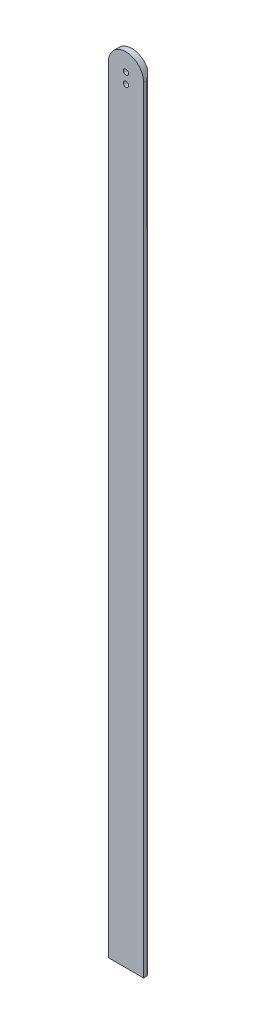
ISO-10303-21;
HEADER;
FILE_DESCRIPTION(('STEP AP214'),'2;1');
FILE_NAME('part.step','',(''),(''),'','','');
FILE_SCHEMA(('AUTOMOTIVE_DESIGN { 1 0 10303 214 1 1 1 1 }'));
ENDSEC;
DATA;
#1=APPLICATION_CONTEXT('core data for automotive mechanical design processes');
#2=APPLICATION_PROTOCOL_DEFINITION('international standard','automotive_design',2000,#1);
#3=PRODUCT_CONTEXT('',#1,'mechanical');
#4=PRODUCT('Part','Part','',(#3));
#5=PRODUCT_RELATED_PRODUCT_CATEGORY('part','',(#4));
#6=PRODUCT_DEFINITION_FORMATION('','',#4);
#7=PRODUCT_DEFINITION_CONTEXT('part definition',#1,'design');
#8=PRODUCT_DEFINITION('design','',#6,#7);
#9=PRODUCT_DEFINITION_SHAPE('','',#8);
#10=(LENGTH_UNIT() NAMED_UNIT(*) SI_UNIT(.MILLI.,.METRE.));
#11=(NAMED_UNIT(*) PLANE_ANGLE_UNIT() SI_UNIT($,.RADIAN.));
#12=(NAMED_UNIT(*) SI_UNIT($,.STERADIAN.) SOLID_ANGLE_UNIT());
#13=UNCERTAINTY_MEASURE_WITH_UNIT(LENGTH_MEASURE(1.E-05),#10,'distance_accuracy_value','');
#14=(GEOMETRIC_REPRESENTATION_CONTEXT(3) GLOBAL_UNCERTAINTY_ASSIGNED_CONTEXT((#13)) GLOBAL_UNIT_ASSIGNED_CONTEXT((#10,
#11,#12)) REPRESENTATION_CONTEXT('',''));
#15=CARTESIAN_POINT('',(0.,0.,0.));
#16=DIRECTION('',(0.,0.,1.));
#17=DIRECTION('',(1.,0.,0.));
#18=AXIS2_PLACEMENT_3D('',#15,#16,#17);
#19=CARTESIAN_POINT('',(0.,431.8,0.));
#20=DIRECTION('',(0.,0.,-1.));
#21=DIRECTION('',(-1.,0.,0.));
#22=AXIS2_PLACEMENT_3D('',#19,#20,#21);
#23=PLANE('',#22);
#24=CARTESIAN_POINT('',(9.525,419.735,0.));
#25=DIRECTION('',(0.,0.,-1.));
#26=DIRECTION('',(-1.,0.,0.));
#27=AXIS2_PLACEMENT_3D('',#24,#25,#26);
#28=CIRCLE('',#27,1.42239999999997);
#29=CARTESIAN_POINT('',(8.10260000000003,419.735,0.));
#30=VERTEX_POINT('',#29);
#31=EDGE_CURVE('E237',#30,#30,#28,.T.);
#32=ORIENTED_EDGE('',*,*,#31,.T.);
#33=EDGE_LOOP('',(#32));
#34=FACE_BOUND('',#33,.T.);
#35=CARTESIAN_POINT('',(9.525,414.02,0.));
#36=DIRECTION('',(0.,0.,-1.));
#37=DIRECTION('',(-1.,0.,0.));
#38=AXIS2_PLACEMENT_3D('',#35,#36,#37);
#39=CIRCLE('',#38,1.42239999999999);
#40=CARTESIAN_POINT('',(8.10260000000001,414.02,0.));
#41=VERTEX_POINT('',#40);
#42=EDGE_CURVE('E232',#41,#41,#39,.T.);
#43=ORIENTED_EDGE('',*,*,#42,.T.);
#44=EDGE_LOOP('',(#43));
#45=FACE_BOUND('',#44,.T.);
#46=DIRECTION('',(0.,-1.,0.));
#47=VECTOR('',#46,1.);
#48=CARTESIAN_POINT('',(19.05,431.8,0.));
#49=LINE('',#48,#47);
#50=CARTESIAN_POINT('',(19.05,419.735,0.));
#51=VERTEX_POINT('',#50);
#52=CARTESIAN_POINT('',(19.05,0.,0.));
#53=VERTEX_POINT('',#52);
#54=EDGE_CURVE('E60',#51,#53,#49,.T.);
#55=ORIENTED_EDGE('',*,*,#54,.F.);
#56=CARTESIAN_POINT('',(9.525,419.735,0.));
#57=DIRECTION('',(0.,0.,-1.));
#58=DIRECTION('',(-1.,0.,0.));
#59=AXIS2_PLACEMENT_3D('',#56,#57,#58);
#60=CIRCLE('',#59,9.525);
#61=CARTESIAN_POINT('',(0.,419.735,0.));
#62=VERTEX_POINT('',#61);
#63=EDGE_CURVE('E224',#62,#51,#60,.T.);
#64=ORIENTED_EDGE('',*,*,#63,.F.);
#65=DIRECTION('',(0.,-1.,0.));
#66=VECTOR('',#65,1.);
#67=CARTESIAN_POINT('',(0.,431.8,0.));
#68=LINE('',#67,#66);
#69=CARTESIAN_POINT('',(0.,0.,0.));
#70=VERTEX_POINT('',#69);
#71=EDGE_CURVE('E12',#62,#70,#68,.T.);
#72=ORIENTED_EDGE('',*,*,#71,.T.);
#73=DIRECTION('',(1.,0.,0.));
#74=VECTOR('',#73,1.);
#75=CARTESIAN_POINT('',(0.,0.,0.));
#76=LINE('',#75,#74);
#77=EDGE_CURVE('E172',#70,#53,#76,.T.);
#78=ORIENTED_EDGE('',*,*,#77,.T.);
#79=EDGE_LOOP('',(#55,#64,#72,#78));
#80=FACE_BOUND('',#79,.T.);
#81=ADVANCED_FACE('F52',(#34,#45,#80),#23,.F.);
#82=CARTESIAN_POINT('',(4.76250000000001,431.8,-3.175));
#83=DIRECTION('',(0.,0.,1.));
#84=DIRECTION('',(1.,0.,0.));
#85=AXIS2_PLACEMENT_3D('',#82,#83,#84);
#86=PLANE('',#85);
#87=CARTESIAN_POINT('',(9.525,419.735,-3.175));
#88=DIRECTION('',(0.,0.,-1.));
#89=DIRECTION('',(-1.,0.,0.));
#90=AXIS2_PLACEMENT_3D('',#87,#88,#89);
#91=CIRCLE('',#90,1.42239999999997);
#92=CARTESIAN_POINT('',(8.10260000000003,419.735,-3.175));
#93=VERTEX_POINT('',#92);
#94=EDGE_CURVE('E229',#93,#93,#91,.T.);
#95=ORIENTED_EDGE('',*,*,#94,.F.);
#96=EDGE_LOOP('',(#95));
#97=FACE_BOUND('',#96,.T.);
#98=CARTESIAN_POINT('',(9.525,414.02,-3.175));
#99=DIRECTION('',(0.,0.,-1.));
#100=DIRECTION('',(-1.,0.,0.));
#101=AXIS2_PLACEMENT_3D('',#98,#99,#100);
#102=CIRCLE('',#101,1.42239999999999);
#103=CARTESIAN_POINT('',(8.10260000000001,414.02,-3.175));
#104=VERTEX_POINT('',#103);
#105=EDGE_CURVE('E226',#104,#104,#102,.T.);
#106=ORIENTED_EDGE('',*,*,#105,.F.);
#107=EDGE_LOOP('',(#106));
#108=FACE_BOUND('',#107,.T.);
#109=CARTESIAN_POINT('',(9.525,419.735,-3.175));
#110=DIRECTION('',(0.,0.,-1.));
#111=DIRECTION('',(-1.,0.,0.));
#112=AXIS2_PLACEMENT_3D('',#109,#110,#111);
#113=CIRCLE('',#112,9.525);
#114=CARTESIAN_POINT('',(0.,419.735,-3.175));
#115=VERTEX_POINT('',#114);
#116=CARTESIAN_POINT('',(17.4625,425.000141854689,-3.175));
#117=VERTEX_POINT('',#116);
#118=EDGE_CURVE('E130',#115,#117,#113,.T.);
#119=ORIENTED_EDGE('',*,*,#118,.T.);
#120=DIRECTION('',(0.,-1.,0.));
#121=VECTOR('',#120,1.);
#122=CARTESIAN_POINT('',(17.4625,431.8,-3.175));
#123=LINE('',#122,#121);
#124=CARTESIAN_POINT('',(17.4625,0.,-3.175));
#125=VERTEX_POINT('',#124);
#126=EDGE_CURVE('E135',#117,#125,#123,.T.);
#127=ORIENTED_EDGE('',*,*,#126,.T.);
#128=DIRECTION('',(-1.,0.,0.));
#129=VECTOR('',#128,1.);
#130=CARTESIAN_POINT('',(4.76250000000001,0.,-3.175));
#131=LINE('',#130,#129);
#132=CARTESIAN_POINT('',(4.76250000000001,0.,-3.175));
#133=VERTEX_POINT('',#132);
#134=EDGE_CURVE('E180',#125,#133,#131,.T.);
#135=ORIENTED_EDGE('',*,*,#134,.T.);
#136=DIRECTION('',(0.,-1.,0.));
#137=VECTOR('',#136,1.);
#138=CARTESIAN_POINT('',(4.76250000000001,431.8,-3.175));
#139=LINE('',#138,#137);
#140=CARTESIAN_POINT('',(4.7625,406.4,-3.175));
#141=VERTEX_POINT('',#140);
#142=EDGE_CURVE('E156',#141,#133,#139,.T.);
#143=ORIENTED_EDGE('',*,*,#142,.F.);
#144=DIRECTION('',(1.,0.,0.));
#145=VECTOR('',#144,1.);
#146=CARTESIAN_POINT('',(-3.175,406.4,-3.175));
#147=LINE('',#146,#145);
#148=CARTESIAN_POINT('',(0.,406.4,-3.175));
#149=VERTEX_POINT('',#148);
#150=EDGE_CURVE('E273',#149,#141,#147,.T.);
#151=ORIENTED_EDGE('',*,*,#150,.F.);
#152=DIRECTION('',(0.,-1.,0.));
#153=VECTOR('',#152,1.);
#154=CARTESIAN_POINT('',(0.,431.8,-3.175));
#155=LINE('',#154,#153);
#156=EDGE_CURVE('E138',#115,#149,#155,.T.);
#157=ORIENTED_EDGE('',*,*,#156,.F.);
#158=EDGE_LOOP('',(#119,#127,#135,#143,#151,#157));
#159=FACE_BOUND('',#158,.T.);
#160=ADVANCED_FACE('F132',(#97,#108,#159),#86,.F.);
#161=CARTESIAN_POINT('',(19.05,431.8,-1.58749999999999));
#162=DIRECTION('',(-1.,0.,0.));
#163=DIRECTION('',(0.,0.,1.));
#164=AXIS2_PLACEMENT_3D('',#161,#162,#163);
#165=PLANE('',#164);
#166=DIRECTION('',(0.,0.,-1.));
#167=VECTOR('',#166,1.);
#168=CARTESIAN_POINT('',(19.05,419.735,1.905));
#169=LINE('',#168,#167);
#170=CARTESIAN_POINT('',(19.05,419.735,-1.5875));
#171=VERTEX_POINT('',#170);
#172=EDGE_CURVE('E147',#51,#171,#169,.T.);
#173=ORIENTED_EDGE('',*,*,#172,.F.);
#174=ORIENTED_EDGE('',*,*,#54,.T.);
#175=DIRECTION('',(0.,0.,-1.));
#176=VECTOR('',#175,1.);
#177=CARTESIAN_POINT('',(19.05,0.,-1.58749999999999));
#178=LINE('',#177,#176);
#179=CARTESIAN_POINT('',(19.05,0.,-1.58749999999999));
#180=VERTEX_POINT('',#179);
#181=EDGE_CURVE('E168',#53,#180,#178,.T.);
#182=ORIENTED_EDGE('',*,*,#181,.T.);
#183=DIRECTION('',(0.,-1.,0.));
#184=VECTOR('',#183,1.);
#185=CARTESIAN_POINT('',(19.05,431.8,-1.58749999999999));
#186=LINE('',#185,#184);
#187=EDGE_CURVE('E155',#171,#180,#186,.T.);
#188=ORIENTED_EDGE('',*,*,#187,.F.);
#189=EDGE_LOOP('',(#173,#174,#182,#188));
#190=FACE_BOUND('',#189,.T.);
#191=ADVANCED_FACE('F166',(#190),#165,.F.);
#192=CARTESIAN_POINT('',(17.4625,431.8,-1.5875));
#193=DIRECTION('',(0.,-1.,0.));
#194=DIRECTION('',(0.,0.,-1.));
#195=AXIS2_PLACEMENT_3D('',#192,#193,#194);
#196=CYLINDRICAL_SURFACE('',#195,1.5875);
#197=CARTESIAN_POINT('',(17.4625,425.000141854689,-3.175));
#198=CARTESIAN_POINT('',(17.4997392791749,424.944002925377,-3.17499615214643));
#199=CARTESIAN_POINT('',(17.536373915237,424.887479640377,-3.17369016838649));
#200=CARTESIAN_POINT('',(17.608381935937,424.773758463647,-3.16869556195951));
#201=CARTESIAN_POINT('',(17.6437556487291,424.716560752668,-3.1650075640575));
#202=CARTESIAN_POINT('',(17.7478202530279,424.544244775113,-3.15071764843065));
#203=CARTESIAN_POINT('',(17.8145793164399,424.428215549899,-3.13688830561016));
#204=CARTESIAN_POINT('',(17.9423765063514,424.194932953775,-3.10217348122487));
#205=CARTESIAN_POINT('',(18.0034429518284,424.07768926816,-3.08132560366125));
#206=CARTESIAN_POINT('',(18.120235165676,423.841690327476,-3.033707691186));
#207=CARTESIAN_POINT('',(18.1759578480751,423.722934243319,-3.00693426349496));
#208=CARTESIAN_POINT('',(18.3248482842563,423.387939847565,-2.92485081909493));
#209=CARTESIAN_POINT('',(18.411955398212,423.170354267502,-2.86394499984029));
#210=CARTESIAN_POINT('',(18.5690205190258,422.732576846335,-2.73047394370341));
#211=CARTESIAN_POINT('',(18.6389690874303,422.512383640339,-2.65790232594637));
#212=CARTESIAN_POINT('',(18.7623458871509,422.069537644883,-2.50417825405277));
#213=CARTESIAN_POINT('',(18.8157189940663,421.846879145872,-2.42299834715635));
#214=CARTESIAN_POINT('',(18.9060195544997,421.400511432413,-2.25495823727431));
#215=CARTESIAN_POINT('',(18.9429538877723,421.176802697184,-2.16810042802255));
#216=CARTESIAN_POINT('',(18.9975844367055,420.753006391991,-2.00050701964679));
#217=CARTESIAN_POINT('',(19.0169317294611,420.552986247122,-1.92012802102333));
#218=CARTESIAN_POINT('',(19.0429307652079,420.152986274275,-1.7581235696142));
#219=CARTESIAN_POINT('',(19.0496035846517,419.953006933274,-1.6765004140441));
#220=CARTESIAN_POINT('',(19.049994284112,419.747047487413,-1.59241836542544));
#221=CARTESIAN_POINT('',(19.049999998203,419.741023721279,-1.58995917315923));
#222=CARTESIAN_POINT('',(19.05,419.735,-1.5875));
#223=B_SPLINE_CURVE_WITH_KNOTS('',3,(#197,#198,#199,#200,#201,#202,#203,#204,#205,#206,#207,
#208,#209,#210,#211,#212,#213,#214,#215,#216,#217,#218,#219,#220,#221,#222),.UNSPECIFIED.,.F.,
.F.,(4,2,2,2,2,2,2,2,2,2,2,2,4),(0.,0.202062368680478,0.404071761075603,0.807415380587037,
1.20863147119799,1.61007788229034,2.3354110075171,3.0611422287319,3.78926176219888,
4.51707628479785,5.16601746977767,5.81387857883195,5.83339780765582),.UNSPECIFIED.);
#224=EDGE_CURVE('E142',#171,#117,#223,.F.);
#225=ORIENTED_EDGE('',*,*,#224,.F.);
#226=ORIENTED_EDGE('',*,*,#187,.T.);
#227=CARTESIAN_POINT('',(17.4625,0.,-1.5875));
#228=DIRECTION('',(0.,1.,0.));
#229=DIRECTION('',(0.,0.,-1.));
#230=AXIS2_PLACEMENT_3D('',#227,#228,#229);
#231=CIRCLE('',#230,1.5875);
#232=EDGE_CURVE('E153',#180,#125,#231,.T.);
#233=ORIENTED_EDGE('',*,*,#232,.T.);
#234=ORIENTED_EDGE('',*,*,#126,.F.);
#235=EDGE_LOOP('',(#225,#226,#233,#234));
#236=FACE_BOUND('',#235,.T.);
#237=ADVANCED_FACE('F151',(#236),#196,.T.);
#238=CARTESIAN_POINT('',(0.,431.8,0.));
#239=DIRECTION('',(1.,0.,0.));
#240=DIRECTION('',(0.,0.,-1.));
#241=AXIS2_PLACEMENT_3D('',#238,#239,#240);
#242=PLANE('',#241);
#243=CARTESIAN_POINT('',(0.,109.5375,-11.1125));
#244=DIRECTION('',(1.,0.,0.));
#245=DIRECTION('',(0.,0.,-1.));
#246=AXIS2_PLACEMENT_3D('',#243,#244,#245);
#247=CIRCLE('',#246,1.4224);
#248=CARTESIAN_POINT('',(0.,109.5375,-12.5349));
#249=VERTEX_POINT('',#248);
#250=EDGE_CURVE('E255',#249,#249,#247,.T.);
#251=ORIENTED_EDGE('',*,*,#250,.T.);
#252=EDGE_LOOP('',(#251));
#253=FACE_BOUND('',#252,.T.);
#254=CARTESIAN_POINT('',(0.,395.2875,-11.1125));
#255=DIRECTION('',(1.,0.,0.));
#256=DIRECTION('',(0.,0.,-1.));
#257=AXIS2_PLACEMENT_3D('',#254,#255,#256);
#258=CIRCLE('',#257,1.42239999999999);
#259=CARTESIAN_POINT('',(0.,395.2875,-12.5349));
#260=VERTEX_POINT('',#259);
#261=EDGE_CURVE('E258',#260,#260,#258,.T.);
#262=ORIENTED_EDGE('',*,*,#261,.T.);
#263=EDGE_LOOP('',(#262));
#264=FACE_BOUND('',#263,.T.);
#265=CARTESIAN_POINT('',(0.,11.1125,-11.1125));
#266=DIRECTION('',(1.,0.,0.));
#267=DIRECTION('',(0.,0.,-1.));
#268=AXIS2_PLACEMENT_3D('',#265,#266,#267);
#269=CIRCLE('',#268,1.4224);
#270=CARTESIAN_POINT('',(0.,11.1125,-12.5349));
#271=VERTEX_POINT('',#270);
#272=EDGE_CURVE('E261',#271,#271,#269,.T.);
#273=ORIENTED_EDGE('',*,*,#272,.T.);
#274=EDGE_LOOP('',(#273));
#275=FACE_BOUND('',#274,.T.);
#276=CARTESIAN_POINT('',(0.,296.8625,-11.1125));
#277=DIRECTION('',(1.,0.,0.));
#278=DIRECTION('',(0.,0.,-1.));
#279=AXIS2_PLACEMENT_3D('',#276,#277,#278);
#280=CIRCLE('',#279,1.42239999999999);
#281=CARTESIAN_POINT('',(0.,296.8625,-12.5349));
#282=VERTEX_POINT('',#281);
#283=EDGE_CURVE('E264',#282,#282,#280,.T.);
#284=ORIENTED_EDGE('',*,*,#283,.T.);
#285=EDGE_LOOP('',(#284));
#286=FACE_BOUND('',#285,.T.);
#287=CARTESIAN_POINT('',(0.,203.2,-11.1125));
#288=DIRECTION('',(1.,0.,0.));
#289=DIRECTION('',(0.,0.,-1.));
#290=AXIS2_PLACEMENT_3D('',#287,#288,#289);
#291=CIRCLE('',#290,1.4224);
#292=CARTESIAN_POINT('',(0.,203.2,-12.5349));
#293=VERTEX_POINT('',#292);
#294=EDGE_CURVE('E267',#293,#293,#291,.T.);
#295=ORIENTED_EDGE('',*,*,#294,.T.);
#296=EDGE_LOOP('',(#295));
#297=FACE_BOUND('',#296,.T.);
#298=ORIENTED_EDGE('',*,*,#71,.F.);
#299=DIRECTION('',(0.,0.,-1.));
#300=VECTOR('',#299,1.);
#301=CARTESIAN_POINT('',(0.,419.735,1.905));
#302=LINE('',#301,#300);
#303=EDGE_CURVE('E141',#62,#115,#302,.T.);
#304=ORIENTED_EDGE('',*,*,#303,.T.);
#305=ORIENTED_EDGE('',*,*,#156,.T.);
#306=DIRECTION('',(0.,0.,-1.));
#307=VECTOR('',#306,1.);
#308=CARTESIAN_POINT('',(0.,406.4,0.));
#309=LINE('',#308,#307);
#310=CARTESIAN_POINT('',(0.,406.4,-19.05));
#311=VERTEX_POINT('',#310);
#312=EDGE_CURVE('E217',#149,#311,#309,.T.);
#313=ORIENTED_EDGE('',*,*,#312,.T.);
#314=DIRECTION('',(0.,-1.,0.));
#315=VECTOR('',#314,1.);
#316=CARTESIAN_POINT('',(0.,431.8,-19.05));
#317=LINE('',#316,#315);
#318=CARTESIAN_POINT('',(0.,0.,-19.05));
#319=VERTEX_POINT('',#318);
#320=EDGE_CURVE('E67',#311,#319,#317,.T.);
#321=ORIENTED_EDGE('',*,*,#320,.T.);
#322=DIRECTION('',(0.,0.,1.));
#323=VECTOR('',#322,1.);
#324=CARTESIAN_POINT('',(0.,0.,0.));
#325=LINE('',#324,#323);
#326=EDGE_CURVE('E176',#319,#70,#325,.T.);
#327=ORIENTED_EDGE('',*,*,#326,.T.);
#328=EDGE_LOOP('',(#298,#304,#305,#313,#321,#327));
#329=FACE_BOUND('',#328,.T.);
#330=ADVANCED_FACE('F54',(#253,#264,#275,#286,#297,#329),#242,.F.);
#331=CARTESIAN_POINT('',(4.7625,431.8,-4.7625));
#332=DIRECTION('',(0.,-1.,0.));
#333=DIRECTION('',(0.,0.,-1.));
#334=AXIS2_PLACEMENT_3D('',#331,#332,#333);
#335=CYLINDRICAL_SURFACE('',#334,1.5875);
#336=DIRECTION('',(0.,-1.,0.));
#337=VECTOR('',#336,1.);
#338=CARTESIAN_POINT('',(3.175,431.8,-4.76250000000001));
#339=LINE('',#338,#337);
#340=CARTESIAN_POINT('',(3.175,406.4,-4.76250000000001));
#341=VERTEX_POINT('',#340);
#342=CARTESIAN_POINT('',(3.175,0.,-4.76250000000001));
#343=VERTEX_POINT('',#342);
#344=EDGE_CURVE('E159',#341,#343,#339,.T.);
#345=ORIENTED_EDGE('',*,*,#344,.F.);
#346=CARTESIAN_POINT('',(4.7625,406.4,-4.7625));
#347=DIRECTION('',(0.,-1.,0.));
#348=DIRECTION('',(0.,0.,-1.));
#349=AXIS2_PLACEMENT_3D('',#346,#347,#348);
#350=CIRCLE('',#349,1.5875);
#351=EDGE_CURVE('E270',#341,#141,#350,.F.);
#352=ORIENTED_EDGE('',*,*,#351,.T.);
#353=ORIENTED_EDGE('',*,*,#142,.T.);
#354=CARTESIAN_POINT('',(4.7625,0.,-4.7625));
#355=DIRECTION('',(0.,-1.,0.));
#356=DIRECTION('',(0.,0.,1.));
#357=AXIS2_PLACEMENT_3D('',#354,#355,#356);
#358=CIRCLE('',#357,1.5875);
#359=EDGE_CURVE('E185',#133,#343,#358,.T.);
#360=ORIENTED_EDGE('',*,*,#359,.T.);
#361=EDGE_LOOP('',(#345,#352,#353,#360));
#362=FACE_BOUND('',#361,.T.);
#363=ADVANCED_FACE('F209',(#362),#335,.F.);
#364=CARTESIAN_POINT('',(3.175,431.8,-4.76250000000001));
#365=DIRECTION('',(-1.,0.,0.));
#366=DIRECTION('',(0.,0.,1.));
#367=AXIS2_PLACEMENT_3D('',#364,#365,#366);
#368=PLANE('',#367);
#369=CARTESIAN_POINT('',(3.175,203.2,-11.1125));
#370=DIRECTION('',(1.,0.,0.));
#371=DIRECTION('',(0.,0.,-1.));
#372=AXIS2_PLACEMENT_3D('',#369,#370,#371);
#373=CIRCLE('',#372,1.4224);
#374=CARTESIAN_POINT('',(3.175,203.2,-12.5349));
#375=VERTEX_POINT('',#374);
#376=EDGE_CURVE('E247',#375,#375,#373,.T.);
#377=ORIENTED_EDGE('',*,*,#376,.F.);
#378=EDGE_LOOP('',(#377));
#379=FACE_BOUND('',#378,.T.);
#380=CARTESIAN_POINT('',(3.175,296.8625,-11.1125));
#381=DIRECTION('',(1.,0.,0.));
#382=DIRECTION('',(0.,0.,-1.));
#383=AXIS2_PLACEMENT_3D('',#380,#381,#382);
#384=CIRCLE('',#383,1.42239999999999);
#385=CARTESIAN_POINT('',(3.175,296.8625,-12.5349));
#386=VERTEX_POINT('',#385);
#387=EDGE_CURVE('E244',#386,#386,#384,.T.);
#388=ORIENTED_EDGE('',*,*,#387,.F.);
#389=EDGE_LOOP('',(#388));
#390=FACE_BOUND('',#389,.T.);
#391=CARTESIAN_POINT('',(3.175,11.1125,-11.1125));
#392=DIRECTION('',(1.,0.,0.));
#393=DIRECTION('',(0.,0.,-1.));
#394=AXIS2_PLACEMENT_3D('',#391,#392,#393);
#395=CIRCLE('',#394,1.4224);
#396=CARTESIAN_POINT('',(3.175,11.1125,-12.5349));
#397=VERTEX_POINT('',#396);
#398=EDGE_CURVE('E241',#397,#397,#395,.T.);
#399=ORIENTED_EDGE('',*,*,#398,.F.);
#400=EDGE_LOOP('',(#399));
#401=FACE_BOUND('',#400,.T.);
#402=CARTESIAN_POINT('',(3.175,395.2875,-11.1125));
#403=DIRECTION('',(1.,0.,0.));
#404=DIRECTION('',(0.,0.,-1.));
#405=AXIS2_PLACEMENT_3D('',#402,#403,#404);
#406=CIRCLE('',#405,1.42239999999999);
#407=CARTESIAN_POINT('',(3.175,395.2875,-12.5349));
#408=VERTEX_POINT('',#407);
#409=EDGE_CURVE('E240',#408,#408,#406,.T.);
#410=ORIENTED_EDGE('',*,*,#409,.F.);
#411=EDGE_LOOP('',(#410));
#412=FACE_BOUND('',#411,.T.);
#413=CARTESIAN_POINT('',(3.175,109.5375,-11.1125));
#414=DIRECTION('',(1.,0.,0.));
#415=DIRECTION('',(0.,0.,-1.));
#416=AXIS2_PLACEMENT_3D('',#413,#414,#415);
#417=CIRCLE('',#416,1.4224);
#418=CARTESIAN_POINT('',(3.175,109.5375,-12.5349));
#419=VERTEX_POINT('',#418);
#420=EDGE_CURVE('E250',#419,#419,#417,.T.);
#421=ORIENTED_EDGE('',*,*,#420,.F.);
#422=EDGE_LOOP('',(#421));
#423=FACE_BOUND('',#422,.T.);
#424=DIRECTION('',(0.,-1.,0.));
#425=VECTOR('',#424,1.);
#426=CARTESIAN_POINT('',(3.175,431.8,-17.4625));
#427=LINE('',#426,#425);
#428=CARTESIAN_POINT('',(3.175,406.4,-17.4625));
#429=VERTEX_POINT('',#428);
#430=CARTESIAN_POINT('',(3.175,0.,-17.4625));
#431=VERTEX_POINT('',#430);
#432=EDGE_CURVE('E197',#429,#431,#427,.T.);
#433=ORIENTED_EDGE('',*,*,#432,.F.);
#434=DIRECTION('',(0.,0.,-1.));
#435=VECTOR('',#434,1.);
#436=CARTESIAN_POINT('',(3.175,406.4,-19.05));
#437=LINE('',#436,#435);
#438=EDGE_CURVE('E205',#341,#429,#437,.T.);
#439=ORIENTED_EDGE('',*,*,#438,.F.);
#440=ORIENTED_EDGE('',*,*,#344,.T.);
#441=DIRECTION('',(0.,0.,-1.));
#442=VECTOR('',#441,1.);
#443=CARTESIAN_POINT('',(3.175,0.,-4.76250000000001));
#444=LINE('',#443,#442);
#445=EDGE_CURVE('E188',#343,#431,#444,.T.);
#446=ORIENTED_EDGE('',*,*,#445,.T.);
#447=EDGE_LOOP('',(#433,#439,#440,#446));
#448=FACE_BOUND('',#447,.T.);
#449=ADVANCED_FACE('F202',(#379,#390,#401,#412,#423,#448),#368,.F.);
#450=CARTESIAN_POINT('',(1.5875,431.8,-17.4625));
#451=DIRECTION('',(0.,-1.,0.));
#452=DIRECTION('',(0.,0.,-1.));
#453=AXIS2_PLACEMENT_3D('',#450,#451,#452);
#454=CYLINDRICAL_SURFACE('',#453,1.5875);
#455=DIRECTION('',(0.,-1.,0.));
#456=VECTOR('',#455,1.);
#457=CARTESIAN_POINT('',(1.58749999999999,431.8,-19.05));
#458=LINE('',#457,#456);
#459=CARTESIAN_POINT('',(1.58749999999999,406.4,-19.05));
#460=VERTEX_POINT('',#459);
#461=CARTESIAN_POINT('',(1.58749999999999,0.,-19.05));
#462=VERTEX_POINT('',#461);
#463=EDGE_CURVE('E74',#460,#462,#458,.T.);
#464=ORIENTED_EDGE('',*,*,#463,.F.);
#465=CARTESIAN_POINT('',(1.5875,406.4,-17.4625));
#466=DIRECTION('',(0.,-1.,0.));
#467=DIRECTION('',(0.,0.,-1.));
#468=AXIS2_PLACEMENT_3D('',#465,#466,#467);
#469=CIRCLE('',#468,1.5875);
#470=EDGE_CURVE('E215',#460,#429,#469,.T.);
#471=ORIENTED_EDGE('',*,*,#470,.T.);
#472=ORIENTED_EDGE('',*,*,#432,.T.);
#473=CARTESIAN_POINT('',(1.5875,0.,-17.4625));
#474=DIRECTION('',(0.,1.,0.));
#475=DIRECTION('',(0.,0.,1.));
#476=AXIS2_PLACEMENT_3D('',#473,#474,#475);
#477=CIRCLE('',#476,1.5875);
#478=EDGE_CURVE('E191',#431,#462,#477,.T.);
#479=ORIENTED_EDGE('',*,*,#478,.T.);
#480=EDGE_LOOP('',(#464,#471,#472,#479));
#481=FACE_BOUND('',#480,.T.);
#482=ADVANCED_FACE('F213',(#481),#454,.T.);
#483=CARTESIAN_POINT('',(0.,431.8,-19.05));
#484=DIRECTION('',(0.,0.,1.));
#485=DIRECTION('',(1.,0.,0.));
#486=AXIS2_PLACEMENT_3D('',#483,#484,#485);
#487=PLANE('',#486);
#488=ORIENTED_EDGE('',*,*,#320,.F.);
#489=DIRECTION('',(1.,0.,0.));
#490=VECTOR('',#489,1.);
#491=CARTESIAN_POINT('',(-3.175,406.4,-19.05));
#492=LINE('',#491,#490);
#493=EDGE_CURVE('E220',#311,#460,#492,.T.);
#494=ORIENTED_EDGE('',*,*,#493,.T.);
#495=ORIENTED_EDGE('',*,*,#463,.T.);
#496=DIRECTION('',(-1.,0.,0.));
#497=VECTOR('',#496,1.);
#498=CARTESIAN_POINT('',(0.,0.,-19.05));
#499=LINE('',#498,#497);
#500=EDGE_CURVE('E193',#462,#319,#499,.T.);
#501=ORIENTED_EDGE('',*,*,#500,.T.);
#502=EDGE_LOOP('',(#488,#494,#495,#501));
#503=FACE_BOUND('',#502,.T.);
#504=ADVANCED_FACE('F275',(#503),#487,.F.);
#505=CARTESIAN_POINT('',(1.5875,0.,-17.4625));
#506=DIRECTION('',(0.,1.,0.));
#507=DIRECTION('',(0.,0.,1.));
#508=AXIS2_PLACEMENT_3D('',#505,#506,#507);
#509=PLANE('',#508);
#510=ORIENTED_EDGE('',*,*,#326,.F.);
#511=ORIENTED_EDGE('',*,*,#500,.F.);
#512=ORIENTED_EDGE('',*,*,#478,.F.);
#513=ORIENTED_EDGE('',*,*,#445,.F.);
#514=ORIENTED_EDGE('',*,*,#359,.F.);
#515=ORIENTED_EDGE('',*,*,#134,.F.);
#516=ORIENTED_EDGE('',*,*,#232,.F.);
#517=ORIENTED_EDGE('',*,*,#181,.F.);
#518=ORIENTED_EDGE('',*,*,#77,.F.);
#519=EDGE_LOOP('',(#510,#511,#512,#513,#514,#515,#516,#517,#518));
#520=FACE_BOUND('',#519,.T.);
#521=ADVANCED_FACE('F178',(#520),#509,.F.);
#522=CARTESIAN_POINT('',(-3.175,406.4,-19.05));
#523=DIRECTION('',(0.,-1.,0.));
#524=DIRECTION('',(0.,0.,-1.));
#525=AXIS2_PLACEMENT_3D('',#522,#523,#524);
#526=PLANE('',#525);
#527=ORIENTED_EDGE('',*,*,#150,.T.);
#528=ORIENTED_EDGE('',*,*,#351,.F.);
#529=ORIENTED_EDGE('',*,*,#438,.T.);
#530=ORIENTED_EDGE('',*,*,#470,.F.);
#531=ORIENTED_EDGE('',*,*,#493,.F.);
#532=ORIENTED_EDGE('',*,*,#312,.F.);
#533=EDGE_LOOP('',(#527,#528,#529,#530,#531,#532));
#534=FACE_BOUND('',#533,.T.);
#535=ADVANCED_FACE('F274',(#534),#526,.F.);
#536=CARTESIAN_POINT('',(-1.905,109.5375,-11.1125));
#537=DIRECTION('',(1.,0.,0.));
#538=DIRECTION('',(0.,0.,-1.));
#539=AXIS2_PLACEMENT_3D('',#536,#537,#538);
#540=CYLINDRICAL_SURFACE('',#539,1.4224);
#541=ORIENTED_EDGE('',*,*,#420,.T.);
#542=EDGE_LOOP('',(#541));
#543=FACE_BOUND('',#542,.T.);
#544=ORIENTED_EDGE('',*,*,#250,.F.);
#545=EDGE_LOOP('',(#544));
#546=FACE_BOUND('',#545,.T.);
#547=ADVANCED_FACE('F326',(#543,#546),#540,.F.);
#548=CARTESIAN_POINT('',(-1.905,395.2875,-11.1125));
#549=DIRECTION('',(1.,0.,0.));
#550=DIRECTION('',(0.,0.,-1.));
#551=AXIS2_PLACEMENT_3D('',#548,#549,#550);
#552=CYLINDRICAL_SURFACE('',#551,1.42239999999999);
#553=ORIENTED_EDGE('',*,*,#409,.T.);
#554=EDGE_LOOP('',(#553));
#555=FACE_BOUND('',#554,.T.);
#556=ORIENTED_EDGE('',*,*,#261,.F.);
#557=EDGE_LOOP('',(#556));
#558=FACE_BOUND('',#557,.T.);
#559=ADVANCED_FACE('F322',(#555,#558),#552,.F.);
#560=CARTESIAN_POINT('',(-1.905,11.1125,-11.1125));
#561=DIRECTION('',(1.,0.,0.));
#562=DIRECTION('',(0.,0.,-1.));
#563=AXIS2_PLACEMENT_3D('',#560,#561,#562);
#564=CYLINDRICAL_SURFACE('',#563,1.4224);
#565=ORIENTED_EDGE('',*,*,#398,.T.);
#566=EDGE_LOOP('',(#565));
#567=FACE_BOUND('',#566,.T.);
#568=ORIENTED_EDGE('',*,*,#272,.F.);
#569=EDGE_LOOP('',(#568));
#570=FACE_BOUND('',#569,.T.);
#571=ADVANCED_FACE('F318',(#567,#570),#564,.F.);
#572=CARTESIAN_POINT('',(-1.905,296.8625,-11.1125));
#573=DIRECTION('',(1.,0.,0.));
#574=DIRECTION('',(0.,0.,-1.));
#575=AXIS2_PLACEMENT_3D('',#572,#573,#574);
#576=CYLINDRICAL_SURFACE('',#575,1.42239999999999);
#577=ORIENTED_EDGE('',*,*,#387,.T.);
#578=EDGE_LOOP('',(#577));
#579=FACE_BOUND('',#578,.T.);
#580=ORIENTED_EDGE('',*,*,#283,.F.);
#581=EDGE_LOOP('',(#580));
#582=FACE_BOUND('',#581,.T.);
#583=ADVANCED_FACE('F321',(#579,#582),#576,.F.);
#584=CARTESIAN_POINT('',(-1.905,203.2,-11.1125));
#585=DIRECTION('',(1.,0.,0.));
#586=DIRECTION('',(0.,0.,-1.));
#587=AXIS2_PLACEMENT_3D('',#584,#585,#586);
#588=CYLINDRICAL_SURFACE('',#587,1.4224);
#589=ORIENTED_EDGE('',*,*,#376,.T.);
#590=EDGE_LOOP('',(#589));
#591=FACE_BOUND('',#590,.T.);
#592=ORIENTED_EDGE('',*,*,#294,.F.);
#593=EDGE_LOOP('',(#592));
#594=FACE_BOUND('',#593,.T.);
#595=ADVANCED_FACE('F316',(#591,#594),#588,.F.);
#596=CARTESIAN_POINT('',(9.525,414.02,1.905));
#597=DIRECTION('',(0.,0.,-1.));
#598=DIRECTION('',(-1.,0.,0.));
#599=AXIS2_PLACEMENT_3D('',#596,#597,#598);
#600=CYLINDRICAL_SURFACE('',#599,1.42239999999999);
#601=ORIENTED_EDGE('',*,*,#105,.T.);
#602=EDGE_LOOP('',(#601));
#603=FACE_BOUND('',#602,.T.);
#604=ORIENTED_EDGE('',*,*,#42,.F.);
#605=EDGE_LOOP('',(#604));
#606=FACE_BOUND('',#605,.T.);
#607=ADVANCED_FACE('F312',(#603,#606),#600,.F.);
#608=CARTESIAN_POINT('',(9.525,419.735,1.905));
#609=DIRECTION('',(0.,0.,-1.));
#610=DIRECTION('',(-1.,0.,0.));
#611=AXIS2_PLACEMENT_3D('',#608,#609,#610);
#612=CYLINDRICAL_SURFACE('',#611,1.42239999999997);
#613=ORIENTED_EDGE('',*,*,#94,.T.);
#614=EDGE_LOOP('',(#613));
#615=FACE_BOUND('',#614,.T.);
#616=ORIENTED_EDGE('',*,*,#31,.F.);
#617=EDGE_LOOP('',(#616));
#618=FACE_BOUND('',#617,.T.);
#619=ADVANCED_FACE('F309',(#615,#618),#612,.F.);
#620=CARTESIAN_POINT('',(9.525,419.735,1.905));
#621=DIRECTION('',(0.,0.,-1.));
#622=DIRECTION('',(-1.,0.,0.));
#623=AXIS2_PLACEMENT_3D('',#620,#621,#622);
#624=CYLINDRICAL_SURFACE('',#623,9.525);
#625=ORIENTED_EDGE('',*,*,#63,.T.);
#626=ORIENTED_EDGE('',*,*,#172,.T.);
#627=ORIENTED_EDGE('',*,*,#224,.T.);
#628=ORIENTED_EDGE('',*,*,#118,.F.);
#629=ORIENTED_EDGE('',*,*,#303,.F.);
#630=EDGE_LOOP('',(#625,#626,#627,#628,#629));
#631=FACE_BOUND('',#630,.T.);
#632=ADVANCED_FACE('F145',(#631),#624,.T.);
#633=CLOSED_SHELL('',(#81,#160,#191,#237,#330,#363,#449,#482,#504,#521,#535,#547,#559,#571,#583,
#595,#607,#619,#632));
#634=MANIFOLD_SOLID_BREP('B2',#633);
#635=ADVANCED_BREP_SHAPE_REPRESENTATION('',(#18,#634),#14);
#636=SHAPE_DEFINITION_REPRESENTATION(#9,#635);
ENDSEC;
END-ISO-10303-21;
